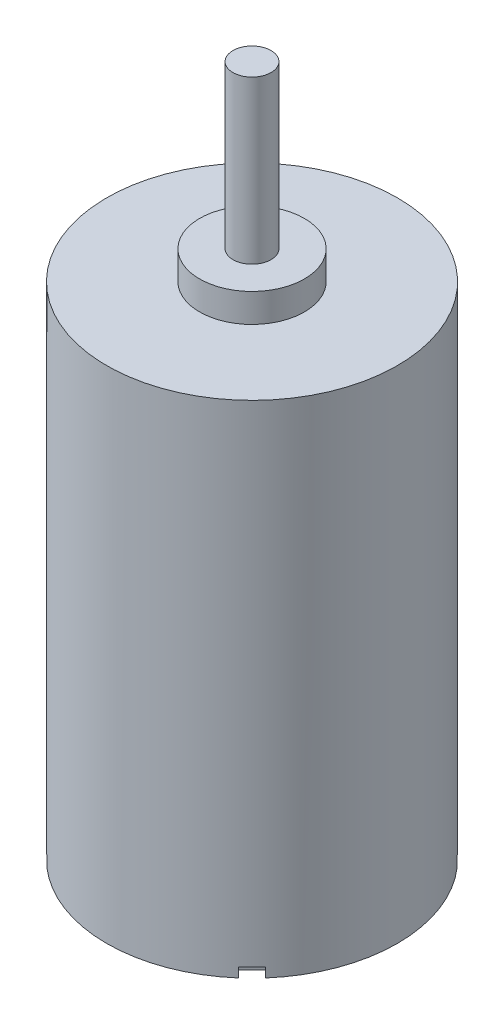
ISO-10303-21;
HEADER;
FILE_DESCRIPTION(('STEP AP214'),'2;1');
FILE_NAME('part.step','',(''),(''),'','','');
FILE_SCHEMA(('AUTOMOTIVE_DESIGN { 1 0 10303 214 1 1 1 1 }'));
ENDSEC;
DATA;
#1=APPLICATION_CONTEXT('core data for automotive mechanical design processes');
#2=APPLICATION_PROTOCOL_DEFINITION('international standard','automotive_design',2000,#1);
#3=PRODUCT_CONTEXT('',#1,'mechanical');
#4=PRODUCT('Part','Part','',(#3));
#5=PRODUCT_RELATED_PRODUCT_CATEGORY('part','',(#4));
#6=PRODUCT_DEFINITION_FORMATION('','',#4);
#7=PRODUCT_DEFINITION_CONTEXT('part definition',#1,'design');
#8=PRODUCT_DEFINITION('design','',#6,#7);
#9=PRODUCT_DEFINITION_SHAPE('','',#8);
#10=(LENGTH_UNIT() NAMED_UNIT(*) SI_UNIT(.MILLI.,.METRE.));
#11=(NAMED_UNIT(*) PLANE_ANGLE_UNIT() SI_UNIT($,.RADIAN.));
#12=(NAMED_UNIT(*) SI_UNIT($,.STERADIAN.) SOLID_ANGLE_UNIT());
#13=UNCERTAINTY_MEASURE_WITH_UNIT(LENGTH_MEASURE(1.E-05),#10,'distance_accuracy_value','');
#14=(GEOMETRIC_REPRESENTATION_CONTEXT(3) GLOBAL_UNCERTAINTY_ASSIGNED_CONTEXT((#13)) GLOBAL_UNIT_ASSIGNED_CONTEXT((#10,
#11,#12)) REPRESENTATION_CONTEXT('',''));
#15=CARTESIAN_POINT('',(0.,0.,0.));
#16=DIRECTION('',(0.,0.,1.));
#17=DIRECTION('',(1.,0.,0.));
#18=AXIS2_PLACEMENT_3D('',#15,#16,#17);
#19=CARTESIAN_POINT('',(0.,0.,0.));
#20=DIRECTION('',(0.,-1.,0.));
#21=DIRECTION('',(0.,0.,-1.));
#22=AXIS2_PLACEMENT_3D('',#19,#20,#21);
#23=PLANE('',#22);
#24=CARTESIAN_POINT('',(-2.,0.,0.));
#25=DIRECTION('',(0.,-1.,0.));
#26=DIRECTION('',(0.,0.,-1.));
#27=AXIS2_PLACEMENT_3D('',#24,#25,#26);
#28=CIRCLE('',#27,0.25);
#29=CARTESIAN_POINT('',(-2.,0.,-0.25));
#30=VERTEX_POINT('',#29);
#31=EDGE_CURVE('E329',#30,#30,#28,.T.);
#32=ORIENTED_EDGE('',*,*,#31,.F.);
#33=EDGE_LOOP('',(#32));
#34=FACE_BOUND('',#33,.T.);
#35=CARTESIAN_POINT('',(2.,0.,0.));
#36=DIRECTION('',(0.,-1.,0.));
#37=DIRECTION('',(0.,0.,-1.));
#38=AXIS2_PLACEMENT_3D('',#35,#36,#37);
#39=CIRCLE('',#38,0.25);
#40=CARTESIAN_POINT('',(2.,0.,-0.25));
#41=VERTEX_POINT('',#40);
#42=EDGE_CURVE('E332',#41,#41,#39,.T.);
#43=ORIENTED_EDGE('',*,*,#42,.F.);
#44=EDGE_LOOP('',(#43));
#45=FACE_BOUND('',#44,.T.);
#46=DIRECTION('',(-0.707106781186553,0.,0.707106781186542));
#47=VECTOR('',#46,1.);
#48=CARTESIAN_POINT('',(2.01061256542841,0.,2.01061256542844));
#49=LINE('',#48,#47);
#50=CARTESIAN_POINT('',(2.15203392166569,0.,1.86919120919115));
#51=VERTEX_POINT('',#50);
#52=CARTESIAN_POINT('',(1.86919120919106,0.,2.15203392166579));
#53=VERTEX_POINT('',#52);
#54=EDGE_CURVE('E158',#51,#53,#49,.T.);
#55=ORIENTED_EDGE('',*,*,#54,.T.);
#56=DIRECTION('',(0.707106781186546,0.,0.707106781186549));
#57=VECTOR('',#56,1.);
#58=CARTESIAN_POINT('',(-0.141421356237359,0.,0.141421356237358));
#59=LINE('',#58,#57);
#60=CARTESIAN_POINT('',(2.01061256542837,0.,2.2934552779031));
#61=VERTEX_POINT('',#60);
#62=EDGE_CURVE('E165',#53,#61,#59,.T.);
#63=ORIENTED_EDGE('',*,*,#62,.T.);
#64=CARTESIAN_POINT('',(0.,0.,0.));
#65=DIRECTION('',(0.,-1.,0.));
#66=DIRECTION('',(0.,0.,-1.));
#67=AXIS2_PLACEMENT_3D('',#64,#65,#66);
#68=CIRCLE('',#67,3.05);
#69=CARTESIAN_POINT('',(-2.01061256542844,0.,2.29345527790303));
#70=VERTEX_POINT('',#69);
#71=EDGE_CURVE('E43',#61,#70,#68,.T.);
#72=ORIENTED_EDGE('',*,*,#71,.T.);
#73=DIRECTION('',(-0.707106781186396,0.,0.707106781186699));
#74=VECTOR('',#73,1.);
#75=CARTESIAN_POINT('',(0.141421356236862,0.,0.141421356236801));
#76=LINE('',#75,#74);
#77=CARTESIAN_POINT('',(-1.86919120919116,0.,2.15203392166569));
#78=VERTEX_POINT('',#77);
#79=EDGE_CURVE('E256',#78,#70,#76,.T.);
#80=ORIENTED_EDGE('',*,*,#79,.F.);
#81=DIRECTION('',(-0.70710678118654,0.,-0.707106781186555));
#82=VECTOR('',#81,1.);
#83=CARTESIAN_POINT('',(-2.01061256542844,0.,2.0106125654284));
#84=LINE('',#83,#82);
#85=CARTESIAN_POINT('',(-2.15203392166579,0.,1.86919120919105));
#86=VERTEX_POINT('',#85);
#87=EDGE_CURVE('E184',#78,#86,#84,.T.);
#88=ORIENTED_EDGE('',*,*,#87,.T.);
#89=DIRECTION('',(-0.707106781186552,0.,0.707106781186543));
#90=VECTOR('',#89,1.);
#91=CARTESIAN_POINT('',(-0.141421356237358,0.,-0.141421356237359));
#92=LINE('',#91,#90);
#93=CARTESIAN_POINT('',(-2.2934552779031,0.,2.01061256542836));
#94=VERTEX_POINT('',#93);
#95=EDGE_CURVE('E246',#86,#94,#92,.T.);
#96=ORIENTED_EDGE('',*,*,#95,.T.);
#97=CARTESIAN_POINT('',(-2.29345527790305,0.,-2.01061256542842));
#98=VERTEX_POINT('',#97);
#99=EDGE_CURVE('E11',#94,#98,#68,.T.);
#100=ORIENTED_EDGE('',*,*,#99,.T.);
#101=DIRECTION('',(-0.707106781186707,0.,-0.707106781186388));
#102=VECTOR('',#101,1.);
#103=CARTESIAN_POINT('',(-0.141421356236799,0.,0.141421356236863));
#104=LINE('',#103,#102);
#105=CARTESIAN_POINT('',(-2.15203392166571,0.,-1.86919120919114));
#106=VERTEX_POINT('',#105);
#107=EDGE_CURVE('E229',#106,#98,#104,.T.);
#108=ORIENTED_EDGE('',*,*,#107,.F.);
#109=DIRECTION('',(0.707106781186548,0.,-0.707106781186547));
#110=VECTOR('',#109,1.);
#111=CARTESIAN_POINT('',(-2.01061256542842,0.,-2.01061256542842));
#112=LINE('',#111,#110);
#113=CARTESIAN_POINT('',(-1.86919120919107,0.,-2.15203392166577));
#114=VERTEX_POINT('',#113);
#115=EDGE_CURVE('E226',#106,#114,#112,.T.);
#116=ORIENTED_EDGE('',*,*,#115,.T.);
#117=DIRECTION('',(-0.707106781186551,0.,-0.707106781186544));
#118=VECTOR('',#117,1.);
#119=CARTESIAN_POINT('',(0.141421356237358,0.,-0.141421356237359));
#120=LINE('',#119,#118);
#121=CARTESIAN_POINT('',(-2.01061256542838,0.,-2.29345527790308));
#122=VERTEX_POINT('',#121);
#123=EDGE_CURVE('E218',#114,#122,#120,.T.);
#124=ORIENTED_EDGE('',*,*,#123,.T.);
#125=CARTESIAN_POINT('',(2.01061256542844,0.,-2.29345527790303));
#126=VERTEX_POINT('',#125);
#127=EDGE_CURVE('E42',#122,#126,#68,.T.);
#128=ORIENTED_EDGE('',*,*,#127,.T.);
#129=DIRECTION('',(0.707106781186396,0.,-0.707106781186699));
#130=VECTOR('',#129,1.);
#131=CARTESIAN_POINT('',(-0.141421356236862,0.,-0.141421356236801));
#132=LINE('',#131,#130);
#133=CARTESIAN_POINT('',(1.86919120919116,0.,-2.15203392166569));
#134=VERTEX_POINT('',#133);
#135=EDGE_CURVE('E201',#134,#126,#132,.T.);
#136=ORIENTED_EDGE('',*,*,#135,.F.);
#137=DIRECTION('',(0.70710678118654,0.,0.707106781186555));
#138=VECTOR('',#137,1.);
#139=CARTESIAN_POINT('',(2.01061256542844,0.,-2.0106125654284));
#140=LINE('',#139,#138);
#141=CARTESIAN_POINT('',(2.15203392166579,0.,-1.86919120919105));
#142=VERTEX_POINT('',#141);
#143=EDGE_CURVE('E198',#134,#142,#140,.T.);
#144=ORIENTED_EDGE('',*,*,#143,.T.);
#145=DIRECTION('',(0.707106781186552,0.,-0.707106781186543));
#146=VECTOR('',#145,1.);
#147=CARTESIAN_POINT('',(0.141421356237358,0.,0.141421356237359));
#148=LINE('',#147,#146);
#149=CARTESIAN_POINT('',(2.2934552779031,0.,-2.01061256542836));
#150=VERTEX_POINT('',#149);
#151=EDGE_CURVE('E191',#142,#150,#148,.T.);
#152=ORIENTED_EDGE('',*,*,#151,.T.);
#153=CARTESIAN_POINT('',(2.29345527790304,0.,2.01061256542843));
#154=VERTEX_POINT('',#153);
#155=EDGE_CURVE('E285',#150,#154,#68,.T.);
#156=ORIENTED_EDGE('',*,*,#155,.T.);
#157=DIRECTION('',(0.707106781186702,0.,0.707106781186393));
#158=VECTOR('',#157,1.);
#159=CARTESIAN_POINT('',(0.1414213562368,0.,-0.141421356236862));
#160=LINE('',#159,#158);
#161=EDGE_CURVE('E177',#51,#154,#160,.T.);
#162=ORIENTED_EDGE('',*,*,#161,.F.);
#163=EDGE_LOOP('',(#55,#63,#72,#80,#88,#96,#100,#108,#116,#124,#128,#136,#144,#152,#156,#162));
#164=FACE_BOUND('',#163,.T.);
#165=ADVANCED_FACE('F35',(#34,#45,#164),#23,.T.);
#166=CARTESIAN_POINT('',(0.,11.1,0.));
#167=DIRECTION('',(0.,-1.,0.));
#168=DIRECTION('',(0.,0.,-1.));
#169=AXIS2_PLACEMENT_3D('',#166,#167,#168);
#170=CYLINDRICAL_SURFACE('',#169,3.05);
#171=CARTESIAN_POINT('',(0.,10.5,0.));
#172=DIRECTION('',(0.,-1.,0.));
#173=DIRECTION('',(0.,0.,-1.));
#174=AXIS2_PLACEMENT_3D('',#171,#172,#173);
#175=CIRCLE('',#174,3.05);
#176=CARTESIAN_POINT('',(0.,10.5,-3.05));
#177=VERTEX_POINT('',#176);
#178=EDGE_CURVE('E281',#177,#177,#175,.T.);
#179=ORIENTED_EDGE('',*,*,#178,.T.);
#180=EDGE_LOOP('',(#179));
#181=FACE_BOUND('',#180,.T.);
#182=ORIENTED_EDGE('',*,*,#71,.F.);
#183=DIRECTION('',(0.,-1.,0.));
#184=VECTOR('',#183,1.);
#185=CARTESIAN_POINT('',(2.01061256542837,0.2,2.2934552779031));
#186=LINE('',#185,#184);
#187=CARTESIAN_POINT('',(2.01061256542837,0.2,2.2934552779031));
#188=VERTEX_POINT('',#187);
#189=EDGE_CURVE('E185',#188,#61,#186,.T.);
#190=ORIENTED_EDGE('',*,*,#189,.F.);
#191=CARTESIAN_POINT('',(0.,0.2,0.));
#192=DIRECTION('',(0.,-1.,0.));
#193=DIRECTION('',(-1.,0.,0.));
#194=AXIS2_PLACEMENT_3D('',#191,#192,#193);
#195=CIRCLE('',#194,3.05);
#196=CARTESIAN_POINT('',(2.29345527790304,0.200000000000001,2.01061256542843));
#197=VERTEX_POINT('',#196);
#198=EDGE_CURVE('E170',#197,#188,#195,.T.);
#199=ORIENTED_EDGE('',*,*,#198,.F.);
#200=DIRECTION('',(0.,-1.,0.));
#201=VECTOR('',#200,1.);
#202=CARTESIAN_POINT('',(2.29345527790304,0.2,2.01061256542843));
#203=LINE('',#202,#201);
#204=EDGE_CURVE('E161',#197,#154,#203,.T.);
#205=ORIENTED_EDGE('',*,*,#204,.T.);
#206=ORIENTED_EDGE('',*,*,#155,.F.);
#207=DIRECTION('',(0.,-1.,0.));
#208=VECTOR('',#207,1.);
#209=CARTESIAN_POINT('',(2.2934552779031,0.2,-2.01061256542836));
#210=LINE('',#209,#208);
#211=CARTESIAN_POINT('',(2.2934552779031,0.2,-2.01061256542836));
#212=VERTEX_POINT('',#211);
#213=EDGE_CURVE('E208',#212,#150,#210,.T.);
#214=ORIENTED_EDGE('',*,*,#213,.F.);
#215=CARTESIAN_POINT('',(0.,0.2,0.));
#216=DIRECTION('',(0.,-1.,0.));
#217=DIRECTION('',(0.,0.,1.));
#218=AXIS2_PLACEMENT_3D('',#215,#216,#217);
#219=CIRCLE('',#218,3.05);
#220=CARTESIAN_POINT('',(2.01061256542844,0.200000000000001,-2.29345527790303));
#221=VERTEX_POINT('',#220);
#222=EDGE_CURVE('E193',#221,#212,#219,.T.);
#223=ORIENTED_EDGE('',*,*,#222,.F.);
#224=DIRECTION('',(0.,-1.,0.));
#225=VECTOR('',#224,1.);
#226=CARTESIAN_POINT('',(2.01061256542844,0.2,-2.29345527790303));
#227=LINE('',#226,#225);
#228=EDGE_CURVE('E210',#221,#126,#227,.T.);
#229=ORIENTED_EDGE('',*,*,#228,.T.);
#230=ORIENTED_EDGE('',*,*,#127,.F.);
#231=DIRECTION('',(0.,-1.,0.));
#232=VECTOR('',#231,1.);
#233=CARTESIAN_POINT('',(-2.01061256542838,0.2,-2.29345527790308));
#234=LINE('',#233,#232);
#235=CARTESIAN_POINT('',(-2.01061256542838,0.2,-2.29345527790308));
#236=VERTEX_POINT('',#235);
#237=EDGE_CURVE('E236',#236,#122,#234,.T.);
#238=ORIENTED_EDGE('',*,*,#237,.F.);
#239=CARTESIAN_POINT('',(0.,0.2,0.));
#240=DIRECTION('',(0.,-1.,0.));
#241=DIRECTION('',(1.,0.,0.));
#242=AXIS2_PLACEMENT_3D('',#239,#240,#241);
#243=CIRCLE('',#242,3.05);
#244=CARTESIAN_POINT('',(-2.29345527790305,0.200000000000001,-2.01061256542842));
#245=VERTEX_POINT('',#244);
#246=EDGE_CURVE('E220',#245,#236,#243,.T.);
#247=ORIENTED_EDGE('',*,*,#246,.F.);
#248=DIRECTION('',(0.,-1.,0.));
#249=VECTOR('',#248,1.);
#250=CARTESIAN_POINT('',(-2.29345527790305,0.2,-2.01061256542842));
#251=LINE('',#250,#249);
#252=EDGE_CURVE('E238',#245,#98,#251,.T.);
#253=ORIENTED_EDGE('',*,*,#252,.T.);
#254=ORIENTED_EDGE('',*,*,#99,.F.);
#255=DIRECTION('',(0.,-1.,0.));
#256=VECTOR('',#255,1.);
#257=CARTESIAN_POINT('',(-2.2934552779031,0.2,2.01061256542836));
#258=LINE('',#257,#256);
#259=CARTESIAN_POINT('',(-2.2934552779031,0.2,2.01061256542836));
#260=VERTEX_POINT('',#259);
#261=EDGE_CURVE('E265',#260,#94,#258,.T.);
#262=ORIENTED_EDGE('',*,*,#261,.F.);
#263=CARTESIAN_POINT('',(0.,0.2,0.));
#264=DIRECTION('',(0.,-1.,0.));
#265=DIRECTION('',(0.,0.,-1.));
#266=AXIS2_PLACEMENT_3D('',#263,#264,#265);
#267=CIRCLE('',#266,3.05);
#268=CARTESIAN_POINT('',(-2.01061256542844,0.200000000000001,2.29345527790303));
#269=VERTEX_POINT('',#268);
#270=EDGE_CURVE('E248',#269,#260,#267,.T.);
#271=ORIENTED_EDGE('',*,*,#270,.F.);
#272=DIRECTION('',(0.,-1.,0.));
#273=VECTOR('',#272,1.);
#274=CARTESIAN_POINT('',(-2.01061256542844,0.2,2.29345527790303));
#275=LINE('',#274,#273);
#276=EDGE_CURVE('E267',#269,#70,#275,.T.);
#277=ORIENTED_EDGE('',*,*,#276,.T.);
#278=EDGE_LOOP('',(#182,#190,#199,#205,#206,#214,#223,#229,#230,#238,#247,#253,#254,#262,#271,#277));
#279=FACE_BOUND('',#278,.T.);
#280=ADVANCED_FACE('F296',(#181,#279),#170,.T.);
#281=CARTESIAN_POINT('',(0.,10.5,0.));
#282=DIRECTION('',(0.,-1.,0.));
#283=DIRECTION('',(0.,0.,-1.));
#284=AXIS2_PLACEMENT_3D('',#281,#282,#283);
#285=PLANE('',#284);
#286=ORIENTED_EDGE('',*,*,#178,.F.);
#287=EDGE_LOOP('',(#286));
#288=FACE_BOUND('',#287,.T.);
#289=CARTESIAN_POINT('',(0.,10.5,0.));
#290=DIRECTION('',(0.,-1.,0.));
#291=DIRECTION('',(0.,0.,-1.));
#292=AXIS2_PLACEMENT_3D('',#289,#290,#291);
#293=CIRCLE('',#292,1.1);
#294=CARTESIAN_POINT('',(0.,10.5,-1.1));
#295=VERTEX_POINT('',#294);
#296=EDGE_CURVE('E279',#295,#295,#293,.T.);
#297=ORIENTED_EDGE('',*,*,#296,.T.);
#298=EDGE_LOOP('',(#297));
#299=FACE_BOUND('',#298,.T.);
#300=ADVANCED_FACE('F325',(#288,#299),#285,.F.);
#301=CARTESIAN_POINT('',(0.,11.1,0.));
#302=DIRECTION('',(0.,-1.,0.));
#303=DIRECTION('',(0.,0.,-1.));
#304=AXIS2_PLACEMENT_3D('',#301,#302,#303);
#305=CYLINDRICAL_SURFACE('',#304,1.1);
#306=CARTESIAN_POINT('',(0.,11.1,0.));
#307=DIRECTION('',(0.,-1.,0.));
#308=DIRECTION('',(0.,0.,-1.));
#309=AXIS2_PLACEMENT_3D('',#306,#307,#308);
#310=CIRCLE('',#309,1.1);
#311=CARTESIAN_POINT('',(0.,11.1,-1.1));
#312=VERTEX_POINT('',#311);
#313=EDGE_CURVE('E276',#312,#312,#310,.T.);
#314=ORIENTED_EDGE('',*,*,#313,.T.);
#315=EDGE_LOOP('',(#314));
#316=FACE_BOUND('',#315,.T.);
#317=ORIENTED_EDGE('',*,*,#296,.F.);
#318=EDGE_LOOP('',(#317));
#319=FACE_BOUND('',#318,.T.);
#320=ADVANCED_FACE('F539',(#316,#319),#305,.T.);
#321=CARTESIAN_POINT('',(0.,11.1,0.));
#322=DIRECTION('',(0.,-1.,0.));
#323=DIRECTION('',(0.,0.,-1.));
#324=AXIS2_PLACEMENT_3D('',#321,#322,#323);
#325=PLANE('',#324);
#326=ORIENTED_EDGE('',*,*,#313,.F.);
#327=EDGE_LOOP('',(#326));
#328=FACE_BOUND('',#327,.T.);
#329=CARTESIAN_POINT('',(0.,11.1,0.));
#330=DIRECTION('',(0.,-1.,0.));
#331=DIRECTION('',(0.,0.,-1.));
#332=AXIS2_PLACEMENT_3D('',#329,#330,#331);
#333=CIRCLE('',#332,0.4);
#334=CARTESIAN_POINT('',(0.,11.1,-0.4));
#335=VERTEX_POINT('',#334);
#336=EDGE_CURVE('E273',#335,#335,#333,.T.);
#337=ORIENTED_EDGE('',*,*,#336,.T.);
#338=EDGE_LOOP('',(#337));
#339=FACE_BOUND('',#338,.T.);
#340=ADVANCED_FACE('F530',(#328,#339),#325,.F.);
#341=CARTESIAN_POINT('',(0.,11.1,0.));
#342=DIRECTION('',(0.,-1.,0.));
#343=DIRECTION('',(0.,0.,-1.));
#344=AXIS2_PLACEMENT_3D('',#341,#342,#343);
#345=CYLINDRICAL_SURFACE('',#344,0.4);
#346=CARTESIAN_POINT('',(0.,14.5,0.));
#347=DIRECTION('',(0.,-1.,0.));
#348=DIRECTION('',(0.,0.,-1.));
#349=AXIS2_PLACEMENT_3D('',#346,#347,#348);
#350=CIRCLE('',#349,0.4);
#351=CARTESIAN_POINT('',(0.,14.5,-0.4));
#352=VERTEX_POINT('',#351);
#353=EDGE_CURVE('E264',#352,#352,#350,.T.);
#354=ORIENTED_EDGE('',*,*,#353,.T.);
#355=EDGE_LOOP('',(#354));
#356=FACE_BOUND('',#355,.T.);
#357=ORIENTED_EDGE('',*,*,#336,.F.);
#358=EDGE_LOOP('',(#357));
#359=FACE_BOUND('',#358,.T.);
#360=ADVANCED_FACE('F521',(#356,#359),#345,.T.);
#361=CARTESIAN_POINT('',(0.,14.5,0.));
#362=DIRECTION('',(0.,-1.,0.));
#363=DIRECTION('',(0.,0.,-1.));
#364=AXIS2_PLACEMENT_3D('',#361,#362,#363);
#365=PLANE('',#364);
#366=ORIENTED_EDGE('',*,*,#353,.F.);
#367=EDGE_LOOP('',(#366));
#368=FACE_BOUND('',#367,.T.);
#369=ADVANCED_FACE('F512',(#368),#365,.F.);
#370=CARTESIAN_POINT('',(-2.01061256542844,0.2,2.0106125654284));
#371=DIRECTION('',(-0.707106781186555,0.,0.70710678118654));
#372=DIRECTION('',(0.70710678118654,0.,0.707106781186555));
#373=AXIS2_PLACEMENT_3D('',#370,#371,#372);
#374=PLANE('',#373);
#375=ORIENTED_EDGE('',*,*,#87,.F.);
#376=DIRECTION('',(0.,-1.,0.));
#377=VECTOR('',#376,1.);
#378=CARTESIAN_POINT('',(-1.86919120919116,0.2,2.15203392166569));
#379=LINE('',#378,#377);
#380=CARTESIAN_POINT('',(-1.86919120919116,0.2,2.15203392166569));
#381=VERTEX_POINT('',#380);
#382=EDGE_CURVE('E253',#381,#78,#379,.T.);
#383=ORIENTED_EDGE('',*,*,#382,.F.);
#384=DIRECTION('',(-0.70710678118654,0.,-0.707106781186555));
#385=VECTOR('',#384,1.);
#386=CARTESIAN_POINT('',(-2.01061256542844,0.2,2.0106125654284));
#387=LINE('',#386,#385);
#388=CARTESIAN_POINT('',(-2.15203392166579,0.2,1.86919120919105));
#389=VERTEX_POINT('',#388);
#390=EDGE_CURVE('E242',#381,#389,#387,.T.);
#391=ORIENTED_EDGE('',*,*,#390,.T.);
#392=DIRECTION('',(0.,-1.,0.));
#393=VECTOR('',#392,1.);
#394=CARTESIAN_POINT('',(-2.15203392166579,0.2,1.86919120919105));
#395=LINE('',#394,#393);
#396=EDGE_CURVE('E261',#389,#86,#395,.T.);
#397=ORIENTED_EDGE('',*,*,#396,.T.);
#398=EDGE_LOOP('',(#375,#383,#391,#397));
#399=FACE_BOUND('',#398,.T.);
#400=ADVANCED_FACE('F503',(#399),#374,.T.);
#401=CARTESIAN_POINT('',(-0.141421356237358,0.2,-0.141421356237359));
#402=DIRECTION('',(0.707106781186543,0.,0.707106781186552));
#403=DIRECTION('',(0.707106781186552,0.,-0.707106781186543));
#404=AXIS2_PLACEMENT_3D('',#401,#402,#403);
#405=PLANE('',#404);
#406=ORIENTED_EDGE('',*,*,#95,.F.);
#407=ORIENTED_EDGE('',*,*,#396,.F.);
#408=DIRECTION('',(-0.707106781186552,0.,0.707106781186543));
#409=VECTOR('',#408,1.);
#410=CARTESIAN_POINT('',(-0.141421356237358,0.2,-0.141421356237359));
#411=LINE('',#410,#409);
#412=EDGE_CURVE('E251',#389,#260,#411,.T.);
#413=ORIENTED_EDGE('',*,*,#412,.T.);
#414=ORIENTED_EDGE('',*,*,#261,.T.);
#415=EDGE_LOOP('',(#406,#407,#413,#414));
#416=FACE_BOUND('',#415,.T.);
#417=ADVANCED_FACE('F494',(#416),#405,.T.);
#418=CARTESIAN_POINT('',(0.141421356236862,0.2,0.141421356236801));
#419=DIRECTION('',(0.707106781186699,0.,0.707106781186396));
#420=DIRECTION('',(0.707106781186396,0.,-0.707106781186699));
#421=AXIS2_PLACEMENT_3D('',#418,#419,#420);
#422=PLANE('',#421);
#423=ORIENTED_EDGE('',*,*,#79,.T.);
#424=ORIENTED_EDGE('',*,*,#276,.F.);
#425=DIRECTION('',(-0.707106781186396,0.,0.707106781186699));
#426=VECTOR('',#425,1.);
#427=CARTESIAN_POINT('',(0.141421356236862,0.2,0.141421356236801));
#428=LINE('',#427,#426);
#429=EDGE_CURVE('E245',#381,#269,#428,.T.);
#430=ORIENTED_EDGE('',*,*,#429,.F.);
#431=ORIENTED_EDGE('',*,*,#382,.T.);
#432=EDGE_LOOP('',(#423,#424,#430,#431));
#433=FACE_BOUND('',#432,.T.);
#434=ADVANCED_FACE('F485',(#433),#422,.F.);
#435=CARTESIAN_POINT('',(0.,0.2,0.));
#436=DIRECTION('',(0.,-1.,0.));
#437=DIRECTION('',(0.,0.,-1.));
#438=AXIS2_PLACEMENT_3D('',#435,#436,#437);
#439=PLANE('',#438);
#440=ORIENTED_EDGE('',*,*,#390,.F.);
#441=ORIENTED_EDGE('',*,*,#429,.T.);
#442=ORIENTED_EDGE('',*,*,#270,.T.);
#443=ORIENTED_EDGE('',*,*,#412,.F.);
#444=EDGE_LOOP('',(#440,#441,#442,#443));
#445=FACE_BOUND('',#444,.T.);
#446=ADVANCED_FACE('F467',(#445),#439,.T.);
#447=CARTESIAN_POINT('',(-2.01061256542842,0.2,-2.01061256542842));
#448=DIRECTION('',(-0.707106781186547,0.,-0.707106781186548));
#449=DIRECTION('',(-0.707106781186548,0.,0.707106781186547));
#450=AXIS2_PLACEMENT_3D('',#447,#448,#449);
#451=PLANE('',#450);
#452=ORIENTED_EDGE('',*,*,#115,.F.);
#453=DIRECTION('',(0.,-1.,0.));
#454=VECTOR('',#453,1.);
#455=CARTESIAN_POINT('',(-2.15203392166571,0.2,-1.86919120919114));
#456=LINE('',#455,#454);
#457=CARTESIAN_POINT('',(-2.15203392166571,0.2,-1.86919120919114));
#458=VERTEX_POINT('',#457);
#459=EDGE_CURVE('E225',#458,#106,#456,.T.);
#460=ORIENTED_EDGE('',*,*,#459,.F.);
#461=DIRECTION('',(0.707106781186548,0.,-0.707106781186547));
#462=VECTOR('',#461,1.);
#463=CARTESIAN_POINT('',(-2.01061256542842,0.2,-2.01061256542842));
#464=LINE('',#463,#462);
#465=CARTESIAN_POINT('',(-1.86919120919107,0.2,-2.15203392166577));
#466=VERTEX_POINT('',#465);
#467=EDGE_CURVE('E214',#458,#466,#464,.T.);
#468=ORIENTED_EDGE('',*,*,#467,.T.);
#469=DIRECTION('',(0.,-1.,0.));
#470=VECTOR('',#469,1.);
#471=CARTESIAN_POINT('',(-1.86919120919107,0.2,-2.15203392166577));
#472=LINE('',#471,#470);
#473=EDGE_CURVE('E202',#466,#114,#472,.T.);
#474=ORIENTED_EDGE('',*,*,#473,.T.);
#475=EDGE_LOOP('',(#452,#460,#468,#474));
#476=FACE_BOUND('',#475,.T.);
#477=ADVANCED_FACE('F458',(#476),#451,.T.);
#478=CARTESIAN_POINT('',(0.141421356237358,0.2,-0.141421356237359));
#479=DIRECTION('',(-0.707106781186544,0.,0.707106781186551));
#480=DIRECTION('',(0.707106781186551,0.,0.707106781186544));
#481=AXIS2_PLACEMENT_3D('',#478,#479,#480);
#482=PLANE('',#481);
#483=ORIENTED_EDGE('',*,*,#123,.F.);
#484=ORIENTED_EDGE('',*,*,#473,.F.);
#485=DIRECTION('',(-0.707106781186551,0.,-0.707106781186544));
#486=VECTOR('',#485,1.);
#487=CARTESIAN_POINT('',(0.141421356237358,0.2,-0.141421356237359));
#488=LINE('',#487,#486);
#489=EDGE_CURVE('E223',#466,#236,#488,.T.);
#490=ORIENTED_EDGE('',*,*,#489,.T.);
#491=ORIENTED_EDGE('',*,*,#237,.T.);
#492=EDGE_LOOP('',(#483,#484,#490,#491));
#493=FACE_BOUND('',#492,.T.);
#494=ADVANCED_FACE('F449',(#493),#482,.T.);
#495=CARTESIAN_POINT('',(-0.141421356236799,0.2,0.141421356236863));
#496=DIRECTION('',(-0.707106781186388,0.,0.707106781186707));
#497=DIRECTION('',(0.707106781186707,0.,0.707106781186388));
#498=AXIS2_PLACEMENT_3D('',#495,#496,#497);
#499=PLANE('',#498);
#500=ORIENTED_EDGE('',*,*,#107,.T.);
#501=ORIENTED_EDGE('',*,*,#252,.F.);
#502=DIRECTION('',(-0.707106781186707,0.,-0.707106781186388));
#503=VECTOR('',#502,1.);
#504=CARTESIAN_POINT('',(-0.141421356236799,0.2,0.141421356236863));
#505=LINE('',#504,#503);
#506=EDGE_CURVE('E217',#458,#245,#505,.T.);
#507=ORIENTED_EDGE('',*,*,#506,.F.);
#508=ORIENTED_EDGE('',*,*,#459,.T.);
#509=EDGE_LOOP('',(#500,#501,#507,#508));
#510=FACE_BOUND('',#509,.T.);
#511=ADVANCED_FACE('F440',(#510),#499,.F.);
#512=CARTESIAN_POINT('',(0.,0.2,0.));
#513=DIRECTION('',(0.,-1.,0.));
#514=DIRECTION('',(1.,0.,0.));
#515=AXIS2_PLACEMENT_3D('',#512,#513,#514);
#516=PLANE('',#515);
#517=ORIENTED_EDGE('',*,*,#467,.F.);
#518=ORIENTED_EDGE('',*,*,#506,.T.);
#519=ORIENTED_EDGE('',*,*,#246,.T.);
#520=ORIENTED_EDGE('',*,*,#489,.F.);
#521=EDGE_LOOP('',(#517,#518,#519,#520));
#522=FACE_BOUND('',#521,.T.);
#523=ADVANCED_FACE('F432',(#522),#516,.T.);
#524=CARTESIAN_POINT('',(2.01061256542844,0.2,-2.0106125654284));
#525=DIRECTION('',(0.707106781186555,0.,-0.70710678118654));
#526=DIRECTION('',(-0.70710678118654,0.,-0.707106781186555));
#527=AXIS2_PLACEMENT_3D('',#524,#525,#526);
#528=PLANE('',#527);
#529=ORIENTED_EDGE('',*,*,#143,.F.);
#530=DIRECTION('',(0.,-1.,0.));
#531=VECTOR('',#530,1.);
#532=CARTESIAN_POINT('',(1.86919120919116,0.2,-2.15203392166569));
#533=LINE('',#532,#531);
#534=CARTESIAN_POINT('',(1.86919120919116,0.2,-2.15203392166569));
#535=VERTEX_POINT('',#534);
#536=EDGE_CURVE('E197',#535,#134,#533,.T.);
#537=ORIENTED_EDGE('',*,*,#536,.F.);
#538=DIRECTION('',(0.70710678118654,0.,0.707106781186555));
#539=VECTOR('',#538,1.);
#540=CARTESIAN_POINT('',(2.01061256542844,0.2,-2.0106125654284));
#541=LINE('',#540,#539);
#542=CARTESIAN_POINT('',(2.15203392166579,0.2,-1.86919120919105));
#543=VERTEX_POINT('',#542);
#544=EDGE_CURVE('E188',#535,#543,#541,.T.);
#545=ORIENTED_EDGE('',*,*,#544,.T.);
#546=DIRECTION('',(0.,-1.,0.));
#547=VECTOR('',#546,1.);
#548=CARTESIAN_POINT('',(2.15203392166579,0.2,-1.86919120919105));
#549=LINE('',#548,#547);
#550=EDGE_CURVE('E178',#543,#142,#549,.T.);
#551=ORIENTED_EDGE('',*,*,#550,.T.);
#552=EDGE_LOOP('',(#529,#537,#545,#551));
#553=FACE_BOUND('',#552,.T.);
#554=ADVANCED_FACE('F304',(#553),#528,.T.);
#555=CARTESIAN_POINT('',(0.141421356237358,0.2,0.141421356237359));
#556=DIRECTION('',(-0.707106781186543,0.,-0.707106781186552));
#557=DIRECTION('',(-0.707106781186552,0.,0.707106781186543));
#558=AXIS2_PLACEMENT_3D('',#555,#556,#557);
#559=PLANE('',#558);
#560=ORIENTED_EDGE('',*,*,#151,.F.);
#561=ORIENTED_EDGE('',*,*,#550,.F.);
#562=DIRECTION('',(0.707106781186552,0.,-0.707106781186543));
#563=VECTOR('',#562,1.);
#564=CARTESIAN_POINT('',(0.141421356237358,0.2,0.141421356237359));
#565=LINE('',#564,#563);
#566=EDGE_CURVE('E195',#543,#212,#565,.T.);
#567=ORIENTED_EDGE('',*,*,#566,.T.);
#568=ORIENTED_EDGE('',*,*,#213,.T.);
#569=EDGE_LOOP('',(#560,#561,#567,#568));
#570=FACE_BOUND('',#569,.T.);
#571=ADVANCED_FACE('F417',(#570),#559,.T.);
#572=CARTESIAN_POINT('',(-0.141421356236862,0.2,-0.141421356236801));
#573=DIRECTION('',(-0.707106781186699,0.,-0.707106781186396));
#574=DIRECTION('',(-0.707106781186396,0.,0.707106781186699));
#575=AXIS2_PLACEMENT_3D('',#572,#573,#574);
#576=PLANE('',#575);
#577=ORIENTED_EDGE('',*,*,#135,.T.);
#578=ORIENTED_EDGE('',*,*,#228,.F.);
#579=DIRECTION('',(0.707106781186396,0.,-0.707106781186699));
#580=VECTOR('',#579,1.);
#581=CARTESIAN_POINT('',(-0.141421356236862,0.2,-0.141421356236801));
#582=LINE('',#581,#580);
#583=EDGE_CURVE('E58',#535,#221,#582,.T.);
#584=ORIENTED_EDGE('',*,*,#583,.F.);
#585=ORIENTED_EDGE('',*,*,#536,.T.);
#586=EDGE_LOOP('',(#577,#578,#584,#585));
#587=FACE_BOUND('',#586,.T.);
#588=ADVANCED_FACE('F301',(#587),#576,.F.);
#589=CARTESIAN_POINT('',(0.,0.2,0.));
#590=DIRECTION('',(0.,-1.,0.));
#591=DIRECTION('',(0.,0.,1.));
#592=AXIS2_PLACEMENT_3D('',#589,#590,#591);
#593=PLANE('',#592);
#594=ORIENTED_EDGE('',*,*,#544,.F.);
#595=ORIENTED_EDGE('',*,*,#583,.T.);
#596=ORIENTED_EDGE('',*,*,#222,.T.);
#597=ORIENTED_EDGE('',*,*,#566,.F.);
#598=EDGE_LOOP('',(#594,#595,#596,#597));
#599=FACE_BOUND('',#598,.T.);
#600=ADVANCED_FACE('F317',(#599),#593,.T.);
#601=CARTESIAN_POINT('',(2.01061256542841,0.2,2.01061256542844));
#602=DIRECTION('',(0.707106781186542,0.,0.707106781186553));
#603=DIRECTION('',(0.707106781186553,0.,-0.707106781186542));
#604=AXIS2_PLACEMENT_3D('',#601,#602,#603);
#605=PLANE('',#604);
#606=ORIENTED_EDGE('',*,*,#54,.F.);
#607=DIRECTION('',(0.,-1.,0.));
#608=VECTOR('',#607,1.);
#609=CARTESIAN_POINT('',(2.15203392166569,0.2,1.86919120919115));
#610=LINE('',#609,#608);
#611=CARTESIAN_POINT('',(2.15203392166569,0.2,1.86919120919115));
#612=VERTEX_POINT('',#611);
#613=EDGE_CURVE('E152',#612,#51,#610,.T.);
#614=ORIENTED_EDGE('',*,*,#613,.F.);
#615=DIRECTION('',(-0.707106781186553,0.,0.707106781186542));
#616=VECTOR('',#615,1.);
#617=CARTESIAN_POINT('',(2.01061256542841,0.2,2.01061256542844));
#618=LINE('',#617,#616);
#619=CARTESIAN_POINT('',(1.86919120919106,0.2,2.15203392166579));
#620=VERTEX_POINT('',#619);
#621=EDGE_CURVE('E155',#612,#620,#618,.T.);
#622=ORIENTED_EDGE('',*,*,#621,.T.);
#623=DIRECTION('',(0.,-1.,0.));
#624=VECTOR('',#623,1.);
#625=CARTESIAN_POINT('',(1.86919120919106,0.2,2.15203392166579));
#626=LINE('',#625,#624);
#627=EDGE_CURVE('E182',#620,#53,#626,.T.);
#628=ORIENTED_EDGE('',*,*,#627,.T.);
#629=EDGE_LOOP('',(#606,#614,#622,#628));
#630=FACE_BOUND('',#629,.T.);
#631=ADVANCED_FACE('F153',(#630),#605,.T.);
#632=CARTESIAN_POINT('',(-0.141421356237359,0.2,0.141421356237358));
#633=DIRECTION('',(0.707106781186549,0.,-0.707106781186546));
#634=DIRECTION('',(-0.707106781186546,0.,-0.707106781186549));
#635=AXIS2_PLACEMENT_3D('',#632,#633,#634);
#636=PLANE('',#635);
#637=ORIENTED_EDGE('',*,*,#62,.F.);
#638=ORIENTED_EDGE('',*,*,#627,.F.);
#639=DIRECTION('',(0.707106781186546,0.,0.707106781186549));
#640=VECTOR('',#639,1.);
#641=CARTESIAN_POINT('',(-0.141421356237359,0.2,0.141421356237358));
#642=LINE('',#641,#640);
#643=EDGE_CURVE('E162',#620,#188,#642,.T.);
#644=ORIENTED_EDGE('',*,*,#643,.T.);
#645=ORIENTED_EDGE('',*,*,#189,.T.);
#646=EDGE_LOOP('',(#637,#638,#644,#645));
#647=FACE_BOUND('',#646,.T.);
#648=ADVANCED_FACE('F309',(#647),#636,.T.);
#649=CARTESIAN_POINT('',(0.1414213562368,0.2,-0.141421356236862));
#650=DIRECTION('',(0.707106781186393,0.,-0.707106781186702));
#651=DIRECTION('',(-0.707106781186702,0.,-0.707106781186393));
#652=AXIS2_PLACEMENT_3D('',#649,#650,#651);
#653=PLANE('',#652);
#654=ORIENTED_EDGE('',*,*,#161,.T.);
#655=ORIENTED_EDGE('',*,*,#204,.F.);
#656=DIRECTION('',(0.707106781186702,0.,0.707106781186393));
#657=VECTOR('',#656,1.);
#658=CARTESIAN_POINT('',(0.1414213562368,0.2,-0.141421356236862));
#659=LINE('',#658,#657);
#660=EDGE_CURVE('E50',#612,#197,#659,.T.);
#661=ORIENTED_EDGE('',*,*,#660,.F.);
#662=ORIENTED_EDGE('',*,*,#613,.T.);
#663=EDGE_LOOP('',(#654,#655,#661,#662));
#664=FACE_BOUND('',#663,.T.);
#665=ADVANCED_FACE('F167',(#664),#653,.F.);
#666=CARTESIAN_POINT('',(0.,0.2,0.));
#667=DIRECTION('',(0.,-1.,0.));
#668=DIRECTION('',(-1.,0.,0.));
#669=AXIS2_PLACEMENT_3D('',#666,#667,#668);
#670=PLANE('',#669);
#671=ORIENTED_EDGE('',*,*,#621,.F.);
#672=ORIENTED_EDGE('',*,*,#660,.T.);
#673=ORIENTED_EDGE('',*,*,#198,.T.);
#674=ORIENTED_EDGE('',*,*,#643,.F.);
#675=EDGE_LOOP('',(#671,#672,#673,#674));
#676=FACE_BOUND('',#675,.T.);
#677=ADVANCED_FACE('F164',(#676),#670,.T.);
#678=CARTESIAN_POINT('',(2.,0.2,0.));
#679=DIRECTION('',(0.,-1.,0.));
#680=DIRECTION('',(0.,0.,-1.));
#681=AXIS2_PLACEMENT_3D('',#678,#679,#680);
#682=CYLINDRICAL_SURFACE('',#681,0.25);
#683=CARTESIAN_POINT('',(2.,0.2,0.));
#684=DIRECTION('',(0.,-1.,0.));
#685=DIRECTION('',(0.,0.,-1.));
#686=AXIS2_PLACEMENT_3D('',#683,#684,#685);
#687=CIRCLE('',#686,0.25);
#688=CARTESIAN_POINT('',(2.,0.2,-0.25));
#689=VERTEX_POINT('',#688);
#690=EDGE_CURVE('E334',#689,#689,#687,.T.);
#691=ORIENTED_EDGE('',*,*,#690,.F.);
#692=EDGE_LOOP('',(#691));
#693=FACE_BOUND('',#692,.T.);
#694=ORIENTED_EDGE('',*,*,#42,.T.);
#695=EDGE_LOOP('',(#694));
#696=FACE_BOUND('',#695,.T.);
#697=ADVANCED_FACE('F354',(#693,#696),#682,.F.);
#698=CARTESIAN_POINT('',(2.,0.2,0.));
#699=DIRECTION('',(0.,-1.,0.));
#700=DIRECTION('',(0.,0.,-1.));
#701=AXIS2_PLACEMENT_3D('',#698,#699,#700);
#702=PLANE('',#701);
#703=ORIENTED_EDGE('',*,*,#690,.T.);
#704=EDGE_LOOP('',(#703));
#705=FACE_BOUND('',#704,.T.);
#706=ADVANCED_FACE('F347',(#705),#702,.T.);
#707=CARTESIAN_POINT('',(-2.,0.2,0.));
#708=DIRECTION('',(0.,-1.,0.));
#709=DIRECTION('',(0.,0.,-1.));
#710=AXIS2_PLACEMENT_3D('',#707,#708,#709);
#711=CYLINDRICAL_SURFACE('',#710,0.25);
#712=CARTESIAN_POINT('',(-2.,0.2,0.));
#713=DIRECTION('',(0.,-1.,0.));
#714=DIRECTION('',(0.,0.,-1.));
#715=AXIS2_PLACEMENT_3D('',#712,#713,#714);
#716=CIRCLE('',#715,0.25);
#717=CARTESIAN_POINT('',(-2.,0.2,-0.25));
#718=VERTEX_POINT('',#717);
#719=EDGE_CURVE('E230',#718,#718,#716,.T.);
#720=ORIENTED_EDGE('',*,*,#719,.F.);
#721=EDGE_LOOP('',(#720));
#722=FACE_BOUND('',#721,.T.);
#723=ORIENTED_EDGE('',*,*,#31,.T.);
#724=EDGE_LOOP('',(#723));
#725=FACE_BOUND('',#724,.T.);
#726=ADVANCED_FACE('F344',(#722,#725),#711,.F.);
#727=CARTESIAN_POINT('',(-2.,0.2,0.));
#728=DIRECTION('',(0.,-1.,0.));
#729=DIRECTION('',(0.,0.,-1.));
#730=AXIS2_PLACEMENT_3D('',#727,#728,#729);
#731=PLANE('',#730);
#732=ORIENTED_EDGE('',*,*,#719,.T.);
#733=EDGE_LOOP('',(#732));
#734=FACE_BOUND('',#733,.T.);
#735=ADVANCED_FACE('F342',(#734),#731,.T.);
#736=CLOSED_SHELL('',(#165,#280,#300,#320,#340,#360,#369,#400,#417,#434,#446,#477,#494,#511,
#523,#554,#571,#588,#600,#631,#648,#665,#677,#697,#706,#726,#735));
#737=MANIFOLD_SOLID_BREP('B2',#736);
#738=ADVANCED_BREP_SHAPE_REPRESENTATION('',(#18,#737),#14);
#739=SHAPE_DEFINITION_REPRESENTATION(#9,#738);
ENDSEC;
END-ISO-10303-21;
